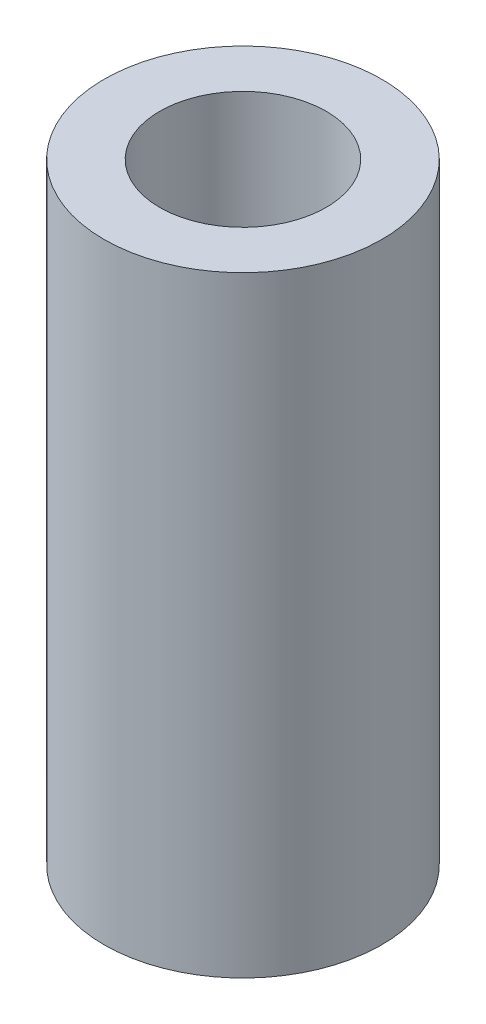
ISO-10303-21;
HEADER;
FILE_DESCRIPTION(('STEP AP214'),'2;1');
FILE_NAME('part.step','',(''),(''),'','','');
FILE_SCHEMA(('AUTOMOTIVE_DESIGN { 1 0 10303 214 1 1 1 1 }'));
ENDSEC;
DATA;
#1=APPLICATION_CONTEXT('core data for automotive mechanical design processes');
#2=APPLICATION_PROTOCOL_DEFINITION('international standard','automotive_design',2000,#1);
#3=PRODUCT_CONTEXT('',#1,'mechanical');
#4=PRODUCT('Part','Part','',(#3));
#5=PRODUCT_RELATED_PRODUCT_CATEGORY('part','',(#4));
#6=PRODUCT_DEFINITION_FORMATION('','',#4);
#7=PRODUCT_DEFINITION_CONTEXT('part definition',#1,'design');
#8=PRODUCT_DEFINITION('design','',#6,#7);
#9=PRODUCT_DEFINITION_SHAPE('','',#8);
#10=(LENGTH_UNIT() NAMED_UNIT(*) SI_UNIT(.MILLI.,.METRE.));
#11=(NAMED_UNIT(*) PLANE_ANGLE_UNIT() SI_UNIT($,.RADIAN.));
#12=(NAMED_UNIT(*) SI_UNIT($,.STERADIAN.) SOLID_ANGLE_UNIT());
#13=UNCERTAINTY_MEASURE_WITH_UNIT(LENGTH_MEASURE(1.E-05),#10,'distance_accuracy_value','');
#14=(GEOMETRIC_REPRESENTATION_CONTEXT(3) GLOBAL_UNCERTAINTY_ASSIGNED_CONTEXT((#13)) GLOBAL_UNIT_ASSIGNED_CONTEXT((#10,
#11,#12)) REPRESENTATION_CONTEXT('',''));
#15=CARTESIAN_POINT('',(0.,0.,0.));
#16=DIRECTION('',(0.,0.,1.));
#17=DIRECTION('',(1.,0.,0.));
#18=AXIS2_PLACEMENT_3D('',#15,#16,#17);
#19=CARTESIAN_POINT('',(0.,11.,0.));
#20=DIRECTION('',(0.,1.,0.));
#21=DIRECTION('',(0.,0.,1.));
#22=AXIS2_PLACEMENT_3D('',#19,#20,#21);
#23=PLANE('',#22);
#24=CARTESIAN_POINT('',(0.,11.,0.));
#25=DIRECTION('',(0.,1.,0.));
#26=DIRECTION('',(0.,0.,1.));
#27=AXIS2_PLACEMENT_3D('',#24,#25,#26);
#28=CIRCLE('',#27,2.5);
#29=CARTESIAN_POINT('',(0.,11.,2.5));
#30=VERTEX_POINT('',#29);
#31=EDGE_CURVE('E10',#30,#30,#28,.T.);
#32=ORIENTED_EDGE('',*,*,#31,.T.);
#33=EDGE_LOOP('',(#32));
#34=FACE_BOUND('',#33,.T.);
#35=CARTESIAN_POINT('',(0.,11.,0.));
#36=DIRECTION('',(0.,1.,0.));
#37=DIRECTION('',(0.,0.,1.));
#38=AXIS2_PLACEMENT_3D('',#35,#36,#37);
#39=CIRCLE('',#38,1.5);
#40=CARTESIAN_POINT('',(0.,11.,1.5));
#41=VERTEX_POINT('',#40);
#42=EDGE_CURVE('E56',#41,#41,#39,.T.);
#43=ORIENTED_EDGE('',*,*,#42,.F.);
#44=EDGE_LOOP('',(#43));
#45=FACE_BOUND('',#44,.T.);
#46=ADVANCED_FACE('F43',(#34,#45),#23,.T.);
#47=CARTESIAN_POINT('',(0.,0.,0.));
#48=DIRECTION('',(0.,1.,0.));
#49=DIRECTION('',(0.,0.,1.));
#50=AXIS2_PLACEMENT_3D('',#47,#48,#49);
#51=PLANE('',#50);
#52=CARTESIAN_POINT('',(0.,0.,0.));
#53=DIRECTION('',(0.,1.,0.));
#54=DIRECTION('',(0.,0.,1.));
#55=AXIS2_PLACEMENT_3D('',#52,#53,#54);
#56=CIRCLE('',#55,2.5);
#57=CARTESIAN_POINT('',(0.,0.,2.5));
#58=VERTEX_POINT('',#57);
#59=EDGE_CURVE('E47',#58,#58,#56,.T.);
#60=ORIENTED_EDGE('',*,*,#59,.F.);
#61=EDGE_LOOP('',(#60));
#62=FACE_BOUND('',#61,.T.);
#63=CARTESIAN_POINT('',(0.,0.,0.));
#64=DIRECTION('',(0.,1.,0.));
#65=DIRECTION('',(0.,0.,1.));
#66=AXIS2_PLACEMENT_3D('',#63,#64,#65);
#67=CIRCLE('',#66,1.5);
#68=CARTESIAN_POINT('',(0.,0.,1.5));
#69=VERTEX_POINT('',#68);
#70=EDGE_CURVE('E58',#69,#69,#67,.T.);
#71=ORIENTED_EDGE('',*,*,#70,.T.);
#72=EDGE_LOOP('',(#71));
#73=FACE_BOUND('',#72,.T.);
#74=ADVANCED_FACE('F70',(#62,#73),#51,.F.);
#75=CARTESIAN_POINT('',(0.,11.,0.));
#76=DIRECTION('',(0.,-1.,0.));
#77=DIRECTION('',(0.,0.,-1.));
#78=AXIS2_PLACEMENT_3D('',#75,#76,#77);
#79=CYLINDRICAL_SURFACE('',#78,2.5);
#80=ORIENTED_EDGE('',*,*,#31,.F.);
#81=EDGE_LOOP('',(#80));
#82=FACE_BOUND('',#81,.T.);
#83=ORIENTED_EDGE('',*,*,#59,.T.);
#84=EDGE_LOOP('',(#83));
#85=FACE_BOUND('',#84,.T.);
#86=ADVANCED_FACE('F45',(#82,#85),#79,.T.);
#87=CARTESIAN_POINT('',(0.,11.,0.));
#88=DIRECTION('',(0.,-1.,0.));
#89=DIRECTION('',(0.,0.,-1.));
#90=AXIS2_PLACEMENT_3D('',#87,#88,#89);
#91=CYLINDRICAL_SURFACE('',#90,1.5);
#92=ORIENTED_EDGE('',*,*,#42,.T.);
#93=EDGE_LOOP('',(#92));
#94=FACE_BOUND('',#93,.T.);
#95=ORIENTED_EDGE('',*,*,#70,.F.);
#96=EDGE_LOOP('',(#95));
#97=FACE_BOUND('',#96,.T.);
#98=ADVANCED_FACE('F66',(#94,#97),#91,.F.);
#99=CLOSED_SHELL('',(#46,#74,#86,#98));
#100=MANIFOLD_SOLID_BREP('B2',#99);
#101=ADVANCED_BREP_SHAPE_REPRESENTATION('',(#18,#100),#14);
#102=SHAPE_DEFINITION_REPRESENTATION(#9,#101);
ENDSEC;
END-ISO-10303-21;
